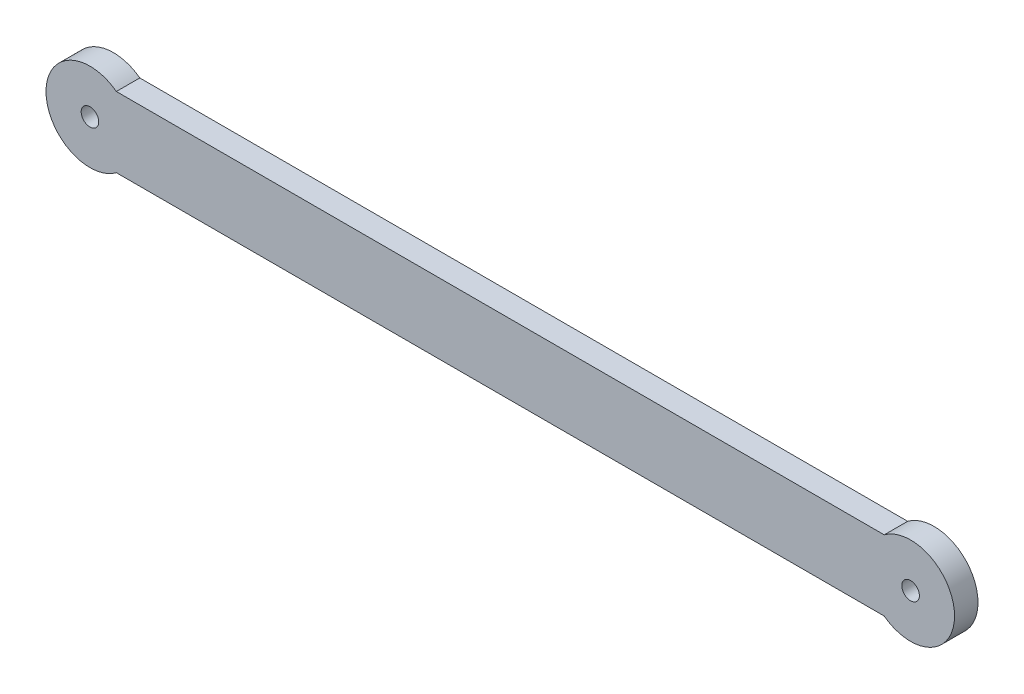
ISO-10303-21;
HEADER;
FILE_DESCRIPTION(('STEP AP214'),'2;1');
FILE_NAME('part.step','',(''),(''),'','','');
FILE_SCHEMA(('AUTOMOTIVE_DESIGN { 1 0 10303 214 1 1 1 1 }'));
ENDSEC;
DATA;
#1=APPLICATION_CONTEXT('core data for automotive mechanical design processes');
#2=APPLICATION_PROTOCOL_DEFINITION('international standard','automotive_design',2000,#1);
#3=PRODUCT_CONTEXT('',#1,'mechanical');
#4=PRODUCT('Part','Part','',(#3));
#5=PRODUCT_RELATED_PRODUCT_CATEGORY('part','',(#4));
#6=PRODUCT_DEFINITION_FORMATION('','',#4);
#7=PRODUCT_DEFINITION_CONTEXT('part definition',#1,'design');
#8=PRODUCT_DEFINITION('design','',#6,#7);
#9=PRODUCT_DEFINITION_SHAPE('','',#8);
#10=(LENGTH_UNIT() NAMED_UNIT(*) SI_UNIT(.MILLI.,.METRE.));
#11=(NAMED_UNIT(*) PLANE_ANGLE_UNIT() SI_UNIT($,.RADIAN.));
#12=(NAMED_UNIT(*) SI_UNIT($,.STERADIAN.) SOLID_ANGLE_UNIT());
#13=UNCERTAINTY_MEASURE_WITH_UNIT(LENGTH_MEASURE(1.E-05),#10,'distance_accuracy_value','');
#14=(GEOMETRIC_REPRESENTATION_CONTEXT(3) GLOBAL_UNCERTAINTY_ASSIGNED_CONTEXT((#13)) GLOBAL_UNIT_ASSIGNED_CONTEXT((#10,
#11,#12)) REPRESENTATION_CONTEXT('',''));
#15=CARTESIAN_POINT('',(0.,0.,0.));
#16=DIRECTION('',(0.,0.,1.));
#17=DIRECTION('',(1.,0.,0.));
#18=AXIS2_PLACEMENT_3D('',#15,#16,#17);
#19=CARTESIAN_POINT('',(0.,0.,4.));
#20=DIRECTION('',(0.,0.,1.));
#21=DIRECTION('',(1.,0.,0.));
#22=AXIS2_PLACEMENT_3D('',#19,#20,#21);
#23=PLANE('',#22);
#24=CARTESIAN_POINT('',(0.,0.,4.));
#25=DIRECTION('',(0.,0.,1.));
#26=DIRECTION('',(1.,0.,0.));
#27=AXIS2_PLACEMENT_3D('',#24,#25,#26);
#28=CIRCLE('',#27,1.5);
#29=CARTESIAN_POINT('',(1.5,0.,4.));
#30=VERTEX_POINT('',#29);
#31=EDGE_CURVE('E99',#30,#30,#28,.T.);
#32=ORIENTED_EDGE('',*,*,#31,.F.);
#33=EDGE_LOOP('',(#32));
#34=FACE_BOUND('',#33,.T.);
#35=CARTESIAN_POINT('',(0.,0.,4.));
#36=DIRECTION('',(0.,0.,1.));
#37=DIRECTION('',(1.,0.,0.));
#38=AXIS2_PLACEMENT_3D('',#35,#36,#37);
#39=CIRCLE('',#38,7.5);
#40=CARTESIAN_POINT('',(4.5,6.,4.));
#41=VERTEX_POINT('',#40);
#42=CARTESIAN_POINT('',(4.5,-6.,4.));
#43=VERTEX_POINT('',#42);
#44=EDGE_CURVE('E84',#41,#43,#39,.T.);
#45=ORIENTED_EDGE('',*,*,#44,.T.);
#46=DIRECTION('',(1.,0.,0.));
#47=VECTOR('',#46,1.);
#48=CARTESIAN_POINT('',(4.5,-6.,4.));
#49=LINE('',#48,#47);
#50=CARTESIAN_POINT('',(135.5,-6.,4.));
#51=VERTEX_POINT('',#50);
#52=EDGE_CURVE('E79',#43,#51,#49,.T.);
#53=ORIENTED_EDGE('',*,*,#52,.T.);
#54=CARTESIAN_POINT('',(140.,0.,4.));
#55=DIRECTION('',(0.,0.,1.));
#56=DIRECTION('',(1.,0.,0.));
#57=AXIS2_PLACEMENT_3D('',#54,#55,#56);
#58=CIRCLE('',#57,7.5);
#59=CARTESIAN_POINT('',(135.5,6.,4.));
#60=VERTEX_POINT('',#59);
#61=EDGE_CURVE('E82',#51,#60,#58,.T.);
#62=ORIENTED_EDGE('',*,*,#61,.T.);
#63=DIRECTION('',(-1.,0.,0.));
#64=VECTOR('',#63,1.);
#65=CARTESIAN_POINT('',(4.5,6.,4.));
#66=LINE('',#65,#64);
#67=EDGE_CURVE('E49',#60,#41,#66,.T.);
#68=ORIENTED_EDGE('',*,*,#67,.T.);
#69=EDGE_LOOP('',(#45,#53,#62,#68));
#70=FACE_BOUND('',#69,.T.);
#71=CARTESIAN_POINT('',(140.,0.,4.));
#72=DIRECTION('',(0.,0.,1.));
#73=DIRECTION('',(1.,0.,0.));
#74=AXIS2_PLACEMENT_3D('',#71,#72,#73);
#75=CIRCLE('',#74,1.5);
#76=CARTESIAN_POINT('',(141.5,0.,4.));
#77=VERTEX_POINT('',#76);
#78=EDGE_CURVE('E114',#77,#77,#75,.T.);
#79=ORIENTED_EDGE('',*,*,#78,.F.);
#80=EDGE_LOOP('',(#79));
#81=FACE_BOUND('',#80,.T.);
#82=ADVANCED_FACE('F32',(#34,#70,#81),#23,.T.);
#83=CARTESIAN_POINT('',(0.,0.,0.));
#84=DIRECTION('',(0.,0.,1.));
#85=DIRECTION('',(1.,0.,0.));
#86=AXIS2_PLACEMENT_3D('',#83,#84,#85);
#87=PLANE('',#86);
#88=CARTESIAN_POINT('',(0.,0.,0.));
#89=DIRECTION('',(0.,0.,1.));
#90=DIRECTION('',(1.,0.,0.));
#91=AXIS2_PLACEMENT_3D('',#88,#89,#90);
#92=CIRCLE('',#91,1.5);
#93=CARTESIAN_POINT('',(1.5,0.,0.));
#94=VERTEX_POINT('',#93);
#95=EDGE_CURVE('E111',#94,#94,#92,.T.);
#96=ORIENTED_EDGE('',*,*,#95,.T.);
#97=EDGE_LOOP('',(#96));
#98=FACE_BOUND('',#97,.T.);
#99=CARTESIAN_POINT('',(0.,0.,0.));
#100=DIRECTION('',(0.,0.,1.));
#101=DIRECTION('',(1.,0.,0.));
#102=AXIS2_PLACEMENT_3D('',#99,#100,#101);
#103=CIRCLE('',#102,7.5);
#104=CARTESIAN_POINT('',(4.5,6.,0.));
#105=VERTEX_POINT('',#104);
#106=CARTESIAN_POINT('',(4.5,-6.,0.));
#107=VERTEX_POINT('',#106);
#108=EDGE_CURVE('E96',#105,#107,#103,.T.);
#109=ORIENTED_EDGE('',*,*,#108,.F.);
#110=DIRECTION('',(-1.,0.,0.));
#111=VECTOR('',#110,1.);
#112=CARTESIAN_POINT('',(4.5,6.,0.));
#113=LINE('',#112,#111);
#114=CARTESIAN_POINT('',(135.5,6.,0.));
#115=VERTEX_POINT('',#114);
#116=EDGE_CURVE('E72',#115,#105,#113,.T.);
#117=ORIENTED_EDGE('',*,*,#116,.F.);
#118=CARTESIAN_POINT('',(140.,0.,0.));
#119=DIRECTION('',(0.,0.,1.));
#120=DIRECTION('',(1.,0.,0.));
#121=AXIS2_PLACEMENT_3D('',#118,#119,#120);
#122=CIRCLE('',#121,7.5);
#123=CARTESIAN_POINT('',(135.5,-6.,0.));
#124=VERTEX_POINT('',#123);
#125=EDGE_CURVE('E66',#124,#115,#122,.T.);
#126=ORIENTED_EDGE('',*,*,#125,.F.);
#127=DIRECTION('',(1.,0.,0.));
#128=VECTOR('',#127,1.);
#129=CARTESIAN_POINT('',(4.5,-6.,0.));
#130=LINE('',#129,#128);
#131=EDGE_CURVE('E88',#107,#124,#130,.T.);
#132=ORIENTED_EDGE('',*,*,#131,.F.);
#133=EDGE_LOOP('',(#109,#117,#126,#132));
#134=FACE_BOUND('',#133,.T.);
#135=CARTESIAN_POINT('',(140.,0.,0.));
#136=DIRECTION('',(0.,0.,1.));
#137=DIRECTION('',(1.,0.,0.));
#138=AXIS2_PLACEMENT_3D('',#135,#136,#137);
#139=CIRCLE('',#138,1.5);
#140=CARTESIAN_POINT('',(141.5,0.,0.));
#141=VERTEX_POINT('',#140);
#142=EDGE_CURVE('E117',#141,#141,#139,.T.);
#143=ORIENTED_EDGE('',*,*,#142,.T.);
#144=EDGE_LOOP('',(#143));
#145=FACE_BOUND('',#144,.T.);
#146=ADVANCED_FACE('F107',(#98,#134,#145),#87,.F.);
#147=CARTESIAN_POINT('',(0.,0.,4.));
#148=DIRECTION('',(0.,0.,-1.));
#149=DIRECTION('',(-1.,0.,0.));
#150=AXIS2_PLACEMENT_3D('',#147,#148,#149);
#151=CYLINDRICAL_SURFACE('',#150,7.5);
#152=ORIENTED_EDGE('',*,*,#108,.T.);
#153=DIRECTION('',(0.,0.,-1.));
#154=VECTOR('',#153,1.);
#155=CARTESIAN_POINT('',(4.5,-6.,4.));
#156=LINE('',#155,#154);
#157=EDGE_CURVE('E11',#43,#107,#156,.T.);
#158=ORIENTED_EDGE('',*,*,#157,.F.);
#159=ORIENTED_EDGE('',*,*,#44,.F.);
#160=DIRECTION('',(0.,0.,-1.));
#161=VECTOR('',#160,1.);
#162=CARTESIAN_POINT('',(4.5,6.,4.));
#163=LINE('',#162,#161);
#164=EDGE_CURVE('E92',#41,#105,#163,.T.);
#165=ORIENTED_EDGE('',*,*,#164,.T.);
#166=EDGE_LOOP('',(#152,#158,#159,#165));
#167=FACE_BOUND('',#166,.T.);
#168=ADVANCED_FACE('F34',(#167),#151,.T.);
#169=CARTESIAN_POINT('',(4.5,-6.,4.));
#170=DIRECTION('',(0.,1.,0.));
#171=DIRECTION('',(0.,0.,1.));
#172=AXIS2_PLACEMENT_3D('',#169,#170,#171);
#173=PLANE('',#172);
#174=ORIENTED_EDGE('',*,*,#131,.T.);
#175=DIRECTION('',(0.,0.,-1.));
#176=VECTOR('',#175,1.);
#177=CARTESIAN_POINT('',(135.5,-6.,4.));
#178=LINE('',#177,#176);
#179=EDGE_CURVE('E41',#51,#124,#178,.T.);
#180=ORIENTED_EDGE('',*,*,#179,.F.);
#181=ORIENTED_EDGE('',*,*,#52,.F.);
#182=ORIENTED_EDGE('',*,*,#157,.T.);
#183=EDGE_LOOP('',(#174,#180,#181,#182));
#184=FACE_BOUND('',#183,.T.);
#185=ADVANCED_FACE('F87',(#184),#173,.F.);
#186=CARTESIAN_POINT('',(140.,0.,4.));
#187=DIRECTION('',(0.,0.,-1.));
#188=DIRECTION('',(-1.,0.,0.));
#189=AXIS2_PLACEMENT_3D('',#186,#187,#188);
#190=CYLINDRICAL_SURFACE('',#189,7.5);
#191=ORIENTED_EDGE('',*,*,#125,.T.);
#192=DIRECTION('',(0.,0.,-1.));
#193=VECTOR('',#192,1.);
#194=CARTESIAN_POINT('',(135.5,6.,4.));
#195=LINE('',#194,#193);
#196=EDGE_CURVE('E89',#60,#115,#195,.T.);
#197=ORIENTED_EDGE('',*,*,#196,.F.);
#198=ORIENTED_EDGE('',*,*,#61,.F.);
#199=ORIENTED_EDGE('',*,*,#179,.T.);
#200=EDGE_LOOP('',(#191,#197,#198,#199));
#201=FACE_BOUND('',#200,.T.);
#202=ADVANCED_FACE('F90',(#201),#190,.T.);
#203=CARTESIAN_POINT('',(4.5,6.,4.));
#204=DIRECTION('',(0.,-1.,0.));
#205=DIRECTION('',(0.,0.,-1.));
#206=AXIS2_PLACEMENT_3D('',#203,#204,#205);
#207=PLANE('',#206);
#208=ORIENTED_EDGE('',*,*,#116,.T.);
#209=ORIENTED_EDGE('',*,*,#164,.F.);
#210=ORIENTED_EDGE('',*,*,#67,.F.);
#211=ORIENTED_EDGE('',*,*,#196,.T.);
#212=EDGE_LOOP('',(#208,#209,#210,#211));
#213=FACE_BOUND('',#212,.T.);
#214=ADVANCED_FACE('F104',(#213),#207,.F.);
#215=CARTESIAN_POINT('',(0.,0.,4.));
#216=DIRECTION('',(0.,0.,-1.));
#217=DIRECTION('',(-1.,0.,0.));
#218=AXIS2_PLACEMENT_3D('',#215,#216,#217);
#219=CYLINDRICAL_SURFACE('',#218,1.5);
#220=ORIENTED_EDGE('',*,*,#31,.T.);
#221=EDGE_LOOP('',(#220));
#222=FACE_BOUND('',#221,.T.);
#223=ORIENTED_EDGE('',*,*,#95,.F.);
#224=EDGE_LOOP('',(#223));
#225=FACE_BOUND('',#224,.T.);
#226=ADVANCED_FACE('F135',(#222,#225),#219,.F.);
#227=CARTESIAN_POINT('',(140.,0.,4.));
#228=DIRECTION('',(0.,0.,-1.));
#229=DIRECTION('',(-1.,0.,0.));
#230=AXIS2_PLACEMENT_3D('',#227,#228,#229);
#231=CYLINDRICAL_SURFACE('',#230,1.5);
#232=ORIENTED_EDGE('',*,*,#78,.T.);
#233=EDGE_LOOP('',(#232));
#234=FACE_BOUND('',#233,.T.);
#235=ORIENTED_EDGE('',*,*,#142,.F.);
#236=EDGE_LOOP('',(#235));
#237=FACE_BOUND('',#236,.T.);
#238=ADVANCED_FACE('F123',(#234,#237),#231,.F.);
#239=CLOSED_SHELL('',(#82,#146,#168,#185,#202,#214,#226,#238));
#240=MANIFOLD_SOLID_BREP('B2',#239);
#241=ADVANCED_BREP_SHAPE_REPRESENTATION('',(#18,#240),#14);
#242=SHAPE_DEFINITION_REPRESENTATION(#9,#241);
ENDSEC;
END-ISO-10303-21;
